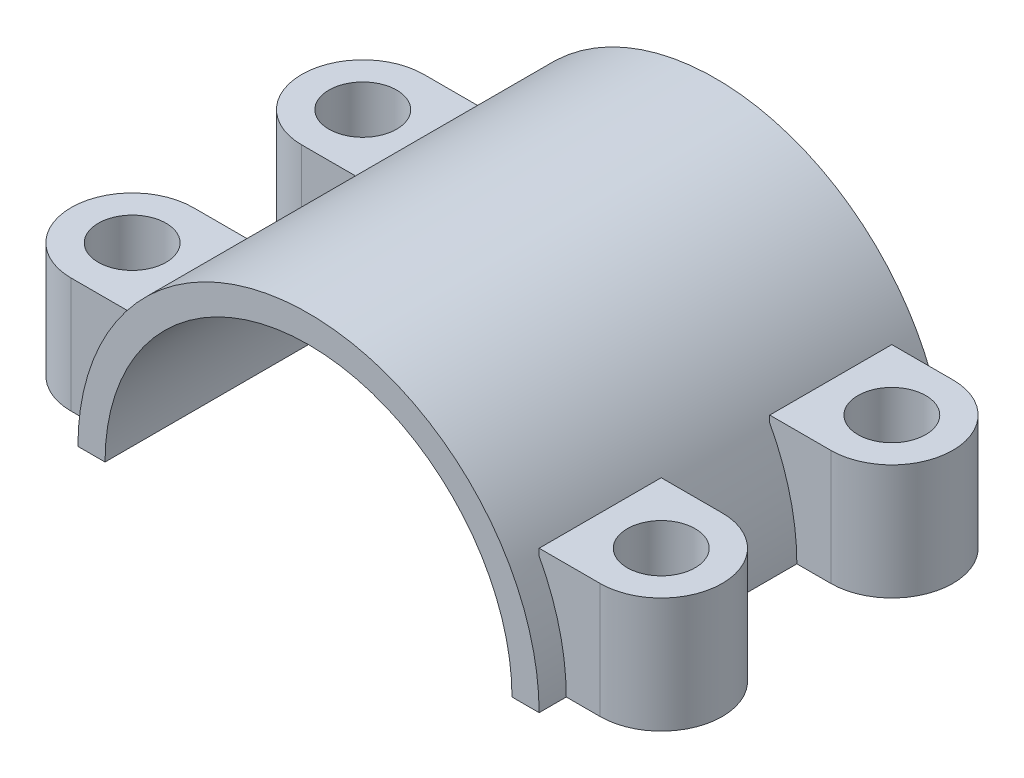
ISO-10303-21;
HEADER;
FILE_DESCRIPTION(('STEP AP214'),'2;1');
FILE_NAME('part.step','',(''),(''),'','','');
FILE_SCHEMA(('AUTOMOTIVE_DESIGN { 1 0 10303 214 1 1 1 1 }'));
ENDSEC;
DATA;
#1=APPLICATION_CONTEXT('core data for automotive mechanical design processes');
#2=APPLICATION_PROTOCOL_DEFINITION('international standard','automotive_design',2000,#1);
#3=PRODUCT_CONTEXT('',#1,'mechanical');
#4=PRODUCT('Part','Part','',(#3));
#5=PRODUCT_RELATED_PRODUCT_CATEGORY('part','',(#4));
#6=PRODUCT_DEFINITION_FORMATION('','',#4);
#7=PRODUCT_DEFINITION_CONTEXT('part definition',#1,'design');
#8=PRODUCT_DEFINITION('design','',#6,#7);
#9=PRODUCT_DEFINITION_SHAPE('','',#8);
#10=(LENGTH_UNIT() NAMED_UNIT(*) SI_UNIT(.MILLI.,.METRE.));
#11=(NAMED_UNIT(*) PLANE_ANGLE_UNIT() SI_UNIT($,.RADIAN.));
#12=(NAMED_UNIT(*) SI_UNIT($,.STERADIAN.) SOLID_ANGLE_UNIT());
#13=UNCERTAINTY_MEASURE_WITH_UNIT(LENGTH_MEASURE(1.E-05),#10,'distance_accuracy_value','');
#14=(GEOMETRIC_REPRESENTATION_CONTEXT(3) GLOBAL_UNCERTAINTY_ASSIGNED_CONTEXT((#13)) GLOBAL_UNIT_ASSIGNED_CONTEXT((#10,
#11,#12)) REPRESENTATION_CONTEXT('',''));
#15=CARTESIAN_POINT('',(0.,0.,0.));
#16=DIRECTION('',(0.,0.,1.));
#17=DIRECTION('',(1.,0.,0.));
#18=AXIS2_PLACEMENT_3D('',#15,#16,#17);
#19=CARTESIAN_POINT('',(24.765,10.795,8.255));
#20=DIRECTION('',(0.,-1.,0.));
#21=DIRECTION('',(0.,0.,-1.));
#22=AXIS2_PLACEMENT_3D('',#19,#20,#21);
#23=CYLINDRICAL_SURFACE('',#22,5.715);
#24=CARTESIAN_POINT('',(24.765,0.,8.255));
#25=DIRECTION('',(0.,-1.,0.));
#26=DIRECTION('',(0.,0.,1.));
#27=AXIS2_PLACEMENT_3D('',#24,#25,#26);
#28=CIRCLE('',#27,5.715);
#29=CARTESIAN_POINT('',(24.765,0.,2.54));
#30=VERTEX_POINT('',#29);
#31=CARTESIAN_POINT('',(24.765,0.,13.97));
#32=VERTEX_POINT('',#31);
#33=EDGE_CURVE('E212',#30,#32,#28,.T.);
#34=ORIENTED_EDGE('',*,*,#33,.F.);
#35=DIRECTION('',(0.,-1.,0.));
#36=VECTOR('',#35,1.);
#37=CARTESIAN_POINT('',(24.765,10.795,2.54));
#38=LINE('',#37,#36);
#39=CARTESIAN_POINT('',(24.765,10.795,2.54));
#40=VERTEX_POINT('',#39);
#41=EDGE_CURVE('E51',#40,#30,#38,.T.);
#42=ORIENTED_EDGE('',*,*,#41,.F.);
#43=CARTESIAN_POINT('',(24.765,10.795,8.255));
#44=DIRECTION('',(0.,-1.,0.));
#45=DIRECTION('',(0.,0.,1.));
#46=AXIS2_PLACEMENT_3D('',#43,#44,#45);
#47=CIRCLE('',#46,5.715);
#48=CARTESIAN_POINT('',(24.765,10.795,13.97));
#49=VERTEX_POINT('',#48);
#50=EDGE_CURVE('E210',#40,#49,#47,.T.);
#51=ORIENTED_EDGE('',*,*,#50,.T.);
#52=DIRECTION('',(0.,-1.,0.));
#53=VECTOR('',#52,1.);
#54=CARTESIAN_POINT('',(24.765,10.795,13.97));
#55=LINE('',#54,#53);
#56=EDGE_CURVE('E482',#49,#32,#55,.T.);
#57=ORIENTED_EDGE('',*,*,#56,.T.);
#58=EDGE_LOOP('',(#34,#42,#51,#57));
#59=FACE_BOUND('',#58,.T.);
#60=ADVANCED_FACE('F36',(#59),#23,.T.);
#61=CARTESIAN_POINT('',(24.765,10.795,29.845));
#62=DIRECTION('',(0.,-1.,0.));
#63=DIRECTION('',(0.,0.,-1.));
#64=AXIS2_PLACEMENT_3D('',#61,#62,#63);
#65=CYLINDRICAL_SURFACE('',#64,5.715);
#66=CARTESIAN_POINT('',(24.765,0.,29.845));
#67=DIRECTION('',(0.,-1.,0.));
#68=DIRECTION('',(0.,0.,1.));
#69=AXIS2_PLACEMENT_3D('',#66,#67,#68);
#70=CIRCLE('',#69,5.715);
#71=CARTESIAN_POINT('',(24.765,0.,24.13));
#72=VERTEX_POINT('',#71);
#73=CARTESIAN_POINT('',(24.765,0.,35.56));
#74=VERTEX_POINT('',#73);
#75=EDGE_CURVE('E219',#72,#74,#70,.T.);
#76=ORIENTED_EDGE('',*,*,#75,.F.);
#77=DIRECTION('',(0.,-1.,0.));
#78=VECTOR('',#77,1.);
#79=CARTESIAN_POINT('',(24.765,10.795,24.13));
#80=LINE('',#79,#78);
#81=CARTESIAN_POINT('',(24.765,10.795,24.13));
#82=VERTEX_POINT('',#81);
#83=EDGE_CURVE('E518',#82,#72,#80,.T.);
#84=ORIENTED_EDGE('',*,*,#83,.F.);
#85=CARTESIAN_POINT('',(24.765,10.795,29.845));
#86=DIRECTION('',(0.,-1.,0.));
#87=DIRECTION('',(0.,0.,1.));
#88=AXIS2_PLACEMENT_3D('',#85,#86,#87);
#89=CIRCLE('',#88,5.715);
#90=CARTESIAN_POINT('',(24.765,10.795,35.56));
#91=VERTEX_POINT('',#90);
#92=EDGE_CURVE('E222',#82,#91,#89,.T.);
#93=ORIENTED_EDGE('',*,*,#92,.T.);
#94=DIRECTION('',(0.,-1.,0.));
#95=VECTOR('',#94,1.);
#96=CARTESIAN_POINT('',(24.765,10.795,35.56));
#97=LINE('',#96,#95);
#98=EDGE_CURVE('E506',#91,#74,#97,.T.);
#99=ORIENTED_EDGE('',*,*,#98,.T.);
#100=EDGE_LOOP('',(#76,#84,#93,#99));
#101=FACE_BOUND('',#100,.T.);
#102=ADVANCED_FACE('F402',(#101),#65,.T.);
#103=CARTESIAN_POINT('',(0.,0.,38.1));
#104=DIRECTION('',(0.,0.,-1.));
#105=DIRECTION('',(-1.,0.,0.));
#106=AXIS2_PLACEMENT_3D('',#103,#104,#105);
#107=CYLINDRICAL_SURFACE('',#106,21.59);
#108=DIRECTION('',(0.,0.,-1.));
#109=VECTOR('',#108,1.);
#110=CARTESIAN_POINT('',(19.05,10.16,38.1));
#111=LINE('',#110,#109);
#112=CARTESIAN_POINT('',(19.05,10.16,13.97));
#113=VERTEX_POINT('',#112);
#114=CARTESIAN_POINT('',(19.05,10.16,2.54));
#115=VERTEX_POINT('',#114);
#116=EDGE_CURVE('E494',#113,#115,#111,.T.);
#117=ORIENTED_EDGE('',*,*,#116,.T.);
#118=CARTESIAN_POINT('',(0.,0.,2.54));
#119=DIRECTION('',(0.,0.,-1.));
#120=DIRECTION('',(-1.,0.,0.));
#121=AXIS2_PLACEMENT_3D('',#118,#119,#120);
#122=CIRCLE('',#121,21.59);
#123=CARTESIAN_POINT('',(21.59,0.,2.54));
#124=VERTEX_POINT('',#123);
#125=EDGE_CURVE('E356',#115,#124,#122,.T.);
#126=ORIENTED_EDGE('',*,*,#125,.T.);
#127=DIRECTION('',(0.,0.,-1.));
#128=VECTOR('',#127,1.);
#129=CARTESIAN_POINT('',(21.59,0.,38.1));
#130=LINE('',#129,#128);
#131=CARTESIAN_POINT('',(21.59,0.,0.));
#132=VERTEX_POINT('',#131);
#133=EDGE_CURVE('E343',#124,#132,#130,.T.);
#134=ORIENTED_EDGE('',*,*,#133,.T.);
#135=CARTESIAN_POINT('',(0.,0.,0.));
#136=DIRECTION('',(0.,0.,1.));
#137=DIRECTION('',(1.,0.,0.));
#138=AXIS2_PLACEMENT_3D('',#135,#136,#137);
#139=CIRCLE('',#138,21.59);
#140=CARTESIAN_POINT('',(-21.59,0.,0.));
#141=VERTEX_POINT('',#140);
#142=EDGE_CURVE('E334',#132,#141,#139,.T.);
#143=ORIENTED_EDGE('',*,*,#142,.T.);
#144=DIRECTION('',(0.,0.,-1.));
#145=VECTOR('',#144,1.);
#146=CARTESIAN_POINT('',(-21.59,0.,38.1));
#147=LINE('',#146,#145);
#148=CARTESIAN_POINT('',(-21.59,0.,2.54000000000001));
#149=VERTEX_POINT('',#148);
#150=EDGE_CURVE('E340',#149,#141,#147,.T.);
#151=ORIENTED_EDGE('',*,*,#150,.F.);
#152=CARTESIAN_POINT('',(0.,0.,2.54));
#153=DIRECTION('',(0.,0.,1.));
#154=DIRECTION('',(1.,0.,0.));
#155=AXIS2_PLACEMENT_3D('',#152,#153,#154);
#156=CIRCLE('',#155,21.59);
#157=CARTESIAN_POINT('',(-19.05,10.16,2.54));
#158=VERTEX_POINT('',#157);
#159=EDGE_CURVE('E268',#158,#149,#156,.T.);
#160=ORIENTED_EDGE('',*,*,#159,.F.);
#161=DIRECTION('',(0.,0.,-1.));
#162=VECTOR('',#161,1.);
#163=CARTESIAN_POINT('',(-19.05,10.16,38.1));
#164=LINE('',#163,#162);
#165=CARTESIAN_POINT('',(-19.05,10.16,13.97));
#166=VERTEX_POINT('',#165);
#167=EDGE_CURVE('E59',#166,#158,#164,.T.);
#168=ORIENTED_EDGE('',*,*,#167,.F.);
#169=CARTESIAN_POINT('',(0.,0.,13.97));
#170=DIRECTION('',(0.,0.,-1.));
#171=DIRECTION('',(-1.,0.,0.));
#172=AXIS2_PLACEMENT_3D('',#169,#170,#171);
#173=CIRCLE('',#172,21.59);
#174=CARTESIAN_POINT('',(-21.59,0.,13.97));
#175=VERTEX_POINT('',#174);
#176=EDGE_CURVE('E272',#175,#166,#173,.T.);
#177=ORIENTED_EDGE('',*,*,#176,.F.);
#178=CARTESIAN_POINT('',(-21.59,0.,24.13));
#179=VERTEX_POINT('',#178);
#180=EDGE_CURVE('E344',#179,#175,#147,.T.);
#181=ORIENTED_EDGE('',*,*,#180,.F.);
#182=CARTESIAN_POINT('',(0.,0.,24.13));
#183=DIRECTION('',(0.,0.,1.));
#184=DIRECTION('',(1.,0.,0.));
#185=AXIS2_PLACEMENT_3D('',#182,#183,#184);
#186=CIRCLE('',#185,21.59);
#187=CARTESIAN_POINT('',(-19.05,10.16,24.13));
#188=VERTEX_POINT('',#187);
#189=EDGE_CURVE('E299',#188,#179,#186,.T.);
#190=ORIENTED_EDGE('',*,*,#189,.F.);
#191=DIRECTION('',(0.,0.,-1.));
#192=VECTOR('',#191,1.);
#193=CARTESIAN_POINT('',(-19.05,10.16,38.1));
#194=LINE('',#193,#192);
#195=CARTESIAN_POINT('',(-19.05,10.16,35.56));
#196=VERTEX_POINT('',#195);
#197=EDGE_CURVE('E302',#196,#188,#194,.T.);
#198=ORIENTED_EDGE('',*,*,#197,.F.);
#199=CARTESIAN_POINT('',(0.,0.,35.56));
#200=DIRECTION('',(0.,0.,-1.));
#201=DIRECTION('',(-1.,0.,0.));
#202=AXIS2_PLACEMENT_3D('',#199,#200,#201);
#203=CIRCLE('',#202,21.59);
#204=CARTESIAN_POINT('',(-21.59,0.,35.56));
#205=VERTEX_POINT('',#204);
#206=EDGE_CURVE('E304',#205,#196,#203,.T.);
#207=ORIENTED_EDGE('',*,*,#206,.F.);
#208=CARTESIAN_POINT('',(-21.59,0.,38.1));
#209=VERTEX_POINT('',#208);
#210=EDGE_CURVE('E341',#209,#205,#147,.T.);
#211=ORIENTED_EDGE('',*,*,#210,.F.);
#212=CARTESIAN_POINT('',(0.,0.,38.1));
#213=DIRECTION('',(0.,0.,1.));
#214=DIRECTION('',(1.,0.,0.));
#215=AXIS2_PLACEMENT_3D('',#212,#213,#214);
#216=CIRCLE('',#215,21.59);
#217=CARTESIAN_POINT('',(21.59,0.,38.1));
#218=VERTEX_POINT('',#217);
#219=EDGE_CURVE('E324',#218,#209,#216,.T.);
#220=ORIENTED_EDGE('',*,*,#219,.F.);
#221=CARTESIAN_POINT('',(21.59,0.,35.56));
#222=VERTEX_POINT('',#221);
#223=EDGE_CURVE('E44',#218,#222,#130,.T.);
#224=ORIENTED_EDGE('',*,*,#223,.T.);
#225=CARTESIAN_POINT('',(0.,0.,35.56));
#226=DIRECTION('',(0.,0.,1.));
#227=DIRECTION('',(1.,0.,0.));
#228=AXIS2_PLACEMENT_3D('',#225,#226,#227);
#229=CIRCLE('',#228,21.59);
#230=CARTESIAN_POINT('',(19.05,10.16,35.56));
#231=VERTEX_POINT('',#230);
#232=EDGE_CURVE('E521',#222,#231,#229,.T.);
#233=ORIENTED_EDGE('',*,*,#232,.T.);
#234=DIRECTION('',(0.,0.,-1.));
#235=VECTOR('',#234,1.);
#236=CARTESIAN_POINT('',(19.05,10.16,38.1));
#237=LINE('',#236,#235);
#238=CARTESIAN_POINT('',(19.05,10.16,24.13));
#239=VERTEX_POINT('',#238);
#240=EDGE_CURVE('E522',#231,#239,#237,.T.);
#241=ORIENTED_EDGE('',*,*,#240,.T.);
#242=CARTESIAN_POINT('',(0.,0.,24.13));
#243=DIRECTION('',(0.,0.,-1.));
#244=DIRECTION('',(-1.,0.,0.));
#245=AXIS2_PLACEMENT_3D('',#242,#243,#244);
#246=CIRCLE('',#245,21.59);
#247=CARTESIAN_POINT('',(21.59,0.,24.13));
#248=VERTEX_POINT('',#247);
#249=EDGE_CURVE('E224',#239,#248,#246,.T.);
#250=ORIENTED_EDGE('',*,*,#249,.T.);
#251=CARTESIAN_POINT('',(21.59,0.,13.97));
#252=VERTEX_POINT('',#251);
#253=EDGE_CURVE('E346',#248,#252,#130,.T.);
#254=ORIENTED_EDGE('',*,*,#253,.T.);
#255=CARTESIAN_POINT('',(0.,0.,13.97));
#256=DIRECTION('',(0.,0.,1.));
#257=DIRECTION('',(1.,0.,0.));
#258=AXIS2_PLACEMENT_3D('',#255,#256,#257);
#259=CIRCLE('',#258,21.59);
#260=EDGE_CURVE('E213',#252,#113,#259,.T.);
#261=ORIENTED_EDGE('',*,*,#260,.T.);
#262=EDGE_LOOP('',(#117,#126,#134,#143,#151,#160,#168,#177,#181,#190,#198,#207,#211,#220,#224,
#233,#241,#250,#254,#261));
#263=FACE_BOUND('',#262,.T.);
#264=ADVANCED_FACE('F353',(#263),#107,.T.);
#265=CARTESIAN_POINT('',(-24.765,10.795,8.255));
#266=DIRECTION('',(0.,-1.,0.));
#267=DIRECTION('',(0.,0.,-1.));
#268=AXIS2_PLACEMENT_3D('',#265,#266,#267);
#269=CYLINDRICAL_SURFACE('',#268,5.715);
#270=DIRECTION('',(0.,-1.,0.));
#271=VECTOR('',#270,1.);
#272=CARTESIAN_POINT('',(-24.765,10.795,13.97));
#273=LINE('',#272,#271);
#274=CARTESIAN_POINT('',(-24.765,10.795,13.97));
#275=VERTEX_POINT('',#274);
#276=CARTESIAN_POINT('',(-24.765,0.,13.97));
#277=VERTEX_POINT('',#276);
#278=EDGE_CURVE('E265',#275,#277,#273,.T.);
#279=ORIENTED_EDGE('',*,*,#278,.F.);
#280=CARTESIAN_POINT('',(-24.765,10.795,8.255));
#281=DIRECTION('',(0.,1.,0.));
#282=DIRECTION('',(0.,0.,1.));
#283=AXIS2_PLACEMENT_3D('',#280,#281,#282);
#284=CIRCLE('',#283,5.715);
#285=CARTESIAN_POINT('',(-24.765,10.795,2.54));
#286=VERTEX_POINT('',#285);
#287=EDGE_CURVE('E307',#286,#275,#284,.T.);
#288=ORIENTED_EDGE('',*,*,#287,.F.);
#289=DIRECTION('',(0.,-1.,0.));
#290=VECTOR('',#289,1.);
#291=CARTESIAN_POINT('',(-24.765,10.795,2.54));
#292=LINE('',#291,#290);
#293=CARTESIAN_POINT('',(-24.765,0.,2.54));
#294=VERTEX_POINT('',#293);
#295=EDGE_CURVE('E252',#286,#294,#292,.T.);
#296=ORIENTED_EDGE('',*,*,#295,.T.);
#297=CARTESIAN_POINT('',(-24.765,0.,8.255));
#298=DIRECTION('',(0.,1.,0.));
#299=DIRECTION('',(0.,0.,1.));
#300=AXIS2_PLACEMENT_3D('',#297,#298,#299);
#301=CIRCLE('',#300,5.715);
#302=EDGE_CURVE('E308',#294,#277,#301,.T.);
#303=ORIENTED_EDGE('',*,*,#302,.T.);
#304=EDGE_LOOP('',(#279,#288,#296,#303));
#305=FACE_BOUND('',#304,.T.);
#306=ADVANCED_FACE('F380',(#305),#269,.T.);
#307=CARTESIAN_POINT('',(-24.765,10.795,29.845));
#308=DIRECTION('',(0.,-1.,0.));
#309=DIRECTION('',(0.,0.,-1.));
#310=AXIS2_PLACEMENT_3D('',#307,#308,#309);
#311=CYLINDRICAL_SURFACE('',#310,5.715);
#312=DIRECTION('',(0.,-1.,0.));
#313=VECTOR('',#312,1.);
#314=CARTESIAN_POINT('',(-24.765,10.795,35.56));
#315=LINE('',#314,#313);
#316=CARTESIAN_POINT('',(-24.765,10.795,35.56));
#317=VERTEX_POINT('',#316);
#318=CARTESIAN_POINT('',(-24.765,0.,35.56));
#319=VERTEX_POINT('',#318);
#320=EDGE_CURVE('E296',#317,#319,#315,.T.);
#321=ORIENTED_EDGE('',*,*,#320,.F.);
#322=CARTESIAN_POINT('',(-24.765,10.795,29.845));
#323=DIRECTION('',(0.,1.,0.));
#324=DIRECTION('',(0.,0.,1.));
#325=AXIS2_PLACEMENT_3D('',#322,#323,#324);
#326=CIRCLE('',#325,5.715);
#327=CARTESIAN_POINT('',(-24.765,10.795,24.13));
#328=VERTEX_POINT('',#327);
#329=EDGE_CURVE('E313',#328,#317,#326,.T.);
#330=ORIENTED_EDGE('',*,*,#329,.F.);
#331=DIRECTION('',(0.,-1.,0.));
#332=VECTOR('',#331,1.);
#333=CARTESIAN_POINT('',(-24.765,10.795,24.13));
#334=LINE('',#333,#332);
#335=CARTESIAN_POINT('',(-24.765,0.,24.13));
#336=VERTEX_POINT('',#335);
#337=EDGE_CURVE('E284',#328,#336,#334,.T.);
#338=ORIENTED_EDGE('',*,*,#337,.T.);
#339=CARTESIAN_POINT('',(-24.765,0.,29.845));
#340=DIRECTION('',(0.,1.,0.));
#341=DIRECTION('',(0.,0.,1.));
#342=AXIS2_PLACEMENT_3D('',#339,#340,#341);
#343=CIRCLE('',#342,5.715);
#344=EDGE_CURVE('E310',#336,#319,#343,.T.);
#345=ORIENTED_EDGE('',*,*,#344,.T.);
#346=EDGE_LOOP('',(#321,#330,#338,#345));
#347=FACE_BOUND('',#346,.T.);
#348=ADVANCED_FACE('F443',(#347),#311,.T.);
#349=CARTESIAN_POINT('',(0.,0.,38.1));
#350=DIRECTION('',(0.,0.,-1.));
#351=DIRECTION('',(-1.,0.,0.));
#352=AXIS2_PLACEMENT_3D('',#349,#350,#351);
#353=CYLINDRICAL_SURFACE('',#352,19.05);
#354=CARTESIAN_POINT('',(0.,0.,0.));
#355=DIRECTION('',(0.,0.,-1.));
#356=DIRECTION('',(1.,0.,0.));
#357=AXIS2_PLACEMENT_3D('',#354,#355,#356);
#358=CIRCLE('',#357,19.05);
#359=CARTESIAN_POINT('',(-19.05,0.,0.));
#360=VERTEX_POINT('',#359);
#361=CARTESIAN_POINT('',(19.05,0.,0.));
#362=VERTEX_POINT('',#361);
#363=EDGE_CURVE('E316',#360,#362,#358,.T.);
#364=ORIENTED_EDGE('',*,*,#363,.T.);
#365=DIRECTION('',(0.,0.,-1.));
#366=VECTOR('',#365,1.);
#367=CARTESIAN_POINT('',(19.05,0.,38.1));
#368=LINE('',#367,#366);
#369=CARTESIAN_POINT('',(19.05,0.,38.1));
#370=VERTEX_POINT('',#369);
#371=EDGE_CURVE('E11',#370,#362,#368,.T.);
#372=ORIENTED_EDGE('',*,*,#371,.F.);
#373=CARTESIAN_POINT('',(0.,0.,38.1));
#374=DIRECTION('',(0.,0.,-1.));
#375=DIRECTION('',(1.,0.,0.));
#376=AXIS2_PLACEMENT_3D('',#373,#374,#375);
#377=CIRCLE('',#376,19.05);
#378=CARTESIAN_POINT('',(-19.05,0.,38.1));
#379=VERTEX_POINT('',#378);
#380=EDGE_CURVE('E318',#379,#370,#377,.T.);
#381=ORIENTED_EDGE('',*,*,#380,.F.);
#382=DIRECTION('',(0.,0.,-1.));
#383=VECTOR('',#382,1.);
#384=CARTESIAN_POINT('',(-19.05,0.,38.1));
#385=LINE('',#384,#383);
#386=EDGE_CURVE('E328',#379,#360,#385,.T.);
#387=ORIENTED_EDGE('',*,*,#386,.T.);
#388=EDGE_LOOP('',(#364,#372,#381,#387));
#389=FACE_BOUND('',#388,.T.);
#390=ADVANCED_FACE('F38',(#389),#353,.F.);
#391=CARTESIAN_POINT('',(19.05,0.,38.1));
#392=DIRECTION('',(0.,1.,0.));
#393=DIRECTION('',(0.,0.,1.));
#394=AXIS2_PLACEMENT_3D('',#391,#392,#393);
#395=PLANE('',#394);
#396=CARTESIAN_POINT('',(24.765,0.,29.845));
#397=DIRECTION('',(0.,-1.,0.));
#398=DIRECTION('',(0.,0.,1.));
#399=AXIS2_PLACEMENT_3D('',#396,#397,#398);
#400=CIRCLE('',#399,3.175);
#401=CARTESIAN_POINT('',(24.765,0.,33.02));
#402=VERTEX_POINT('',#401);
#403=EDGE_CURVE('E466',#402,#402,#400,.T.);
#404=ORIENTED_EDGE('',*,*,#403,.F.);
#405=EDGE_LOOP('',(#404));
#406=FACE_BOUND('',#405,.T.);
#407=CARTESIAN_POINT('',(24.765,0.,8.255));
#408=DIRECTION('',(0.,-1.,0.));
#409=DIRECTION('',(0.,0.,1.));
#410=AXIS2_PLACEMENT_3D('',#407,#408,#409);
#411=CIRCLE('',#410,3.175);
#412=CARTESIAN_POINT('',(24.765,0.,11.43));
#413=VERTEX_POINT('',#412);
#414=EDGE_CURVE('E469',#413,#413,#411,.T.);
#415=ORIENTED_EDGE('',*,*,#414,.F.);
#416=EDGE_LOOP('',(#415));
#417=FACE_BOUND('',#416,.T.);
#418=ORIENTED_EDGE('',*,*,#133,.F.);
#419=DIRECTION('',(1.,0.,0.));
#420=VECTOR('',#419,1.);
#421=CARTESIAN_POINT('',(19.05,0.,2.54));
#422=LINE('',#421,#420);
#423=EDGE_CURVE('E483',#124,#30,#422,.T.);
#424=ORIENTED_EDGE('',*,*,#423,.T.);
#425=ORIENTED_EDGE('',*,*,#33,.T.);
#426=DIRECTION('',(-1.,0.,0.));
#427=VECTOR('',#426,1.);
#428=CARTESIAN_POINT('',(24.765,0.,13.97));
#429=LINE('',#428,#427);
#430=EDGE_CURVE('E204',#32,#252,#429,.T.);
#431=ORIENTED_EDGE('',*,*,#430,.T.);
#432=ORIENTED_EDGE('',*,*,#253,.F.);
#433=DIRECTION('',(1.,0.,0.));
#434=VECTOR('',#433,1.);
#435=CARTESIAN_POINT('',(24.765,0.,24.13));
#436=LINE('',#435,#434);
#437=EDGE_CURVE('E497',#248,#72,#436,.T.);
#438=ORIENTED_EDGE('',*,*,#437,.T.);
#439=ORIENTED_EDGE('',*,*,#75,.T.);
#440=DIRECTION('',(-1.,0.,0.));
#441=VECTOR('',#440,1.);
#442=CARTESIAN_POINT('',(19.05,0.,35.56));
#443=LINE('',#442,#441);
#444=EDGE_CURVE('E501',#74,#222,#443,.T.);
#445=ORIENTED_EDGE('',*,*,#444,.T.);
#446=ORIENTED_EDGE('',*,*,#223,.F.);
#447=DIRECTION('',(1.,0.,0.));
#448=VECTOR('',#447,1.);
#449=CARTESIAN_POINT('',(19.05,0.,38.1));
#450=LINE('',#449,#448);
#451=EDGE_CURVE('E321',#370,#218,#450,.T.);
#452=ORIENTED_EDGE('',*,*,#451,.F.);
#453=ORIENTED_EDGE('',*,*,#371,.T.);
#454=DIRECTION('',(1.,0.,0.));
#455=VECTOR('',#454,1.);
#456=CARTESIAN_POINT('',(19.05,0.,0.));
#457=LINE('',#456,#455);
#458=EDGE_CURVE('E331',#362,#132,#457,.T.);
#459=ORIENTED_EDGE('',*,*,#458,.T.);
#460=EDGE_LOOP('',(#418,#424,#425,#431,#432,#438,#439,#445,#446,#452,#453,#459));
#461=FACE_BOUND('',#460,.T.);
#462=ADVANCED_FACE('F359',(#406,#417,#461),#395,.F.);
#463=CARTESIAN_POINT('',(-21.59,0.,38.1));
#464=DIRECTION('',(0.,1.,0.));
#465=DIRECTION('',(0.,0.,1.));
#466=AXIS2_PLACEMENT_3D('',#463,#464,#465);
#467=PLANE('',#466);
#468=CARTESIAN_POINT('',(-24.765,0.,29.845));
#469=DIRECTION('',(0.,1.,0.));
#470=DIRECTION('',(0.,0.,1.));
#471=AXIS2_PLACEMENT_3D('',#468,#469,#470);
#472=CIRCLE('',#471,3.175);
#473=CARTESIAN_POINT('',(-24.765,0.,33.02));
#474=VERTEX_POINT('',#473);
#475=EDGE_CURVE('E232',#474,#474,#472,.T.);
#476=ORIENTED_EDGE('',*,*,#475,.T.);
#477=EDGE_LOOP('',(#476));
#478=FACE_BOUND('',#477,.T.);
#479=CARTESIAN_POINT('',(-24.765,0.,8.255));
#480=DIRECTION('',(0.,1.,0.));
#481=DIRECTION('',(0.,0.,1.));
#482=AXIS2_PLACEMENT_3D('',#479,#480,#481);
#483=CIRCLE('',#482,3.175);
#484=CARTESIAN_POINT('',(-24.765,0.,11.43));
#485=VERTEX_POINT('',#484);
#486=EDGE_CURVE('E230',#485,#485,#483,.T.);
#487=ORIENTED_EDGE('',*,*,#486,.T.);
#488=EDGE_LOOP('',(#487));
#489=FACE_BOUND('',#488,.T.);
#490=DIRECTION('',(-1.,0.,0.));
#491=VECTOR('',#490,1.);
#492=CARTESIAN_POINT('',(-19.05,0.,2.54));
#493=LINE('',#492,#491);
#494=EDGE_CURVE('E247',#149,#294,#493,.T.);
#495=ORIENTED_EDGE('',*,*,#494,.F.);
#496=ORIENTED_EDGE('',*,*,#150,.T.);
#497=DIRECTION('',(1.,0.,0.));
#498=VECTOR('',#497,1.);
#499=CARTESIAN_POINT('',(-21.59,0.,0.));
#500=LINE('',#499,#498);
#501=EDGE_CURVE('E322',#141,#360,#500,.T.);
#502=ORIENTED_EDGE('',*,*,#501,.T.);
#503=ORIENTED_EDGE('',*,*,#386,.F.);
#504=DIRECTION('',(1.,0.,0.));
#505=VECTOR('',#504,1.);
#506=CARTESIAN_POINT('',(-21.59,0.,38.1));
#507=LINE('',#506,#505);
#508=EDGE_CURVE('E326',#209,#379,#507,.T.);
#509=ORIENTED_EDGE('',*,*,#508,.F.);
#510=ORIENTED_EDGE('',*,*,#210,.T.);
#511=DIRECTION('',(1.,0.,0.));
#512=VECTOR('',#511,1.);
#513=CARTESIAN_POINT('',(-19.05,0.,35.56));
#514=LINE('',#513,#512);
#515=EDGE_CURVE('E274',#319,#205,#514,.T.);
#516=ORIENTED_EDGE('',*,*,#515,.F.);
#517=ORIENTED_EDGE('',*,*,#344,.F.);
#518=DIRECTION('',(-1.,0.,0.));
#519=VECTOR('',#518,1.);
#520=CARTESIAN_POINT('',(-24.765,0.,24.13));
#521=LINE('',#520,#519);
#522=EDGE_CURVE('E279',#179,#336,#521,.T.);
#523=ORIENTED_EDGE('',*,*,#522,.F.);
#524=ORIENTED_EDGE('',*,*,#180,.T.);
#525=DIRECTION('',(1.,0.,0.));
#526=VECTOR('',#525,1.);
#527=CARTESIAN_POINT('',(-24.765,0.,13.97));
#528=LINE('',#527,#526);
#529=EDGE_CURVE('E235',#277,#175,#528,.T.);
#530=ORIENTED_EDGE('',*,*,#529,.F.);
#531=ORIENTED_EDGE('',*,*,#302,.F.);
#532=EDGE_LOOP('',(#495,#496,#502,#503,#509,#510,#516,#517,#523,#524,#530,#531));
#533=FACE_BOUND('',#532,.T.);
#534=ADVANCED_FACE('F367',(#478,#489,#533),#467,.F.);
#535=CARTESIAN_POINT('',(0.,0.,38.1));
#536=DIRECTION('',(0.,0.,1.));
#537=DIRECTION('',(1.,0.,0.));
#538=AXIS2_PLACEMENT_3D('',#535,#536,#537);
#539=PLANE('',#538);
#540=ORIENTED_EDGE('',*,*,#380,.T.);
#541=ORIENTED_EDGE('',*,*,#451,.T.);
#542=ORIENTED_EDGE('',*,*,#219,.T.);
#543=ORIENTED_EDGE('',*,*,#508,.T.);
#544=EDGE_LOOP('',(#540,#541,#542,#543));
#545=FACE_BOUND('',#544,.T.);
#546=ADVANCED_FACE('F447',(#545),#539,.T.);
#547=CARTESIAN_POINT('',(0.,0.,0.));
#548=DIRECTION('',(0.,0.,1.));
#549=DIRECTION('',(1.,0.,0.));
#550=AXIS2_PLACEMENT_3D('',#547,#548,#549);
#551=PLANE('',#550);
#552=ORIENTED_EDGE('',*,*,#363,.F.);
#553=ORIENTED_EDGE('',*,*,#501,.F.);
#554=ORIENTED_EDGE('',*,*,#142,.F.);
#555=ORIENTED_EDGE('',*,*,#458,.F.);
#556=EDGE_LOOP('',(#552,#553,#554,#555));
#557=FACE_BOUND('',#556,.T.);
#558=ADVANCED_FACE('F363',(#557),#551,.F.);
#559=CARTESIAN_POINT('',(-24.765,10.795,29.845));
#560=DIRECTION('',(0.,1.,0.));
#561=DIRECTION('',(0.,0.,1.));
#562=AXIS2_PLACEMENT_3D('',#559,#560,#561);
#563=PLANE('',#562);
#564=CARTESIAN_POINT('',(-24.765,10.795,29.845));
#565=DIRECTION('',(0.,1.,0.));
#566=DIRECTION('',(0.,0.,1.));
#567=AXIS2_PLACEMENT_3D('',#564,#565,#566);
#568=CIRCLE('',#567,3.175);
#569=CARTESIAN_POINT('',(-24.765,10.795,33.02));
#570=VERTEX_POINT('',#569);
#571=EDGE_CURVE('E236',#570,#570,#568,.T.);
#572=ORIENTED_EDGE('',*,*,#571,.F.);
#573=EDGE_LOOP('',(#572));
#574=FACE_BOUND('',#573,.T.);
#575=DIRECTION('',(1.,0.,0.));
#576=VECTOR('',#575,1.);
#577=CARTESIAN_POINT('',(-19.05,10.795,35.56));
#578=LINE('',#577,#576);
#579=CARTESIAN_POINT('',(-19.05,10.795,35.56));
#580=VERTEX_POINT('',#579);
#581=EDGE_CURVE('E275',#317,#580,#578,.T.);
#582=ORIENTED_EDGE('',*,*,#581,.T.);
#583=DIRECTION('',(0.,0.,-1.));
#584=VECTOR('',#583,1.);
#585=CARTESIAN_POINT('',(-19.05,10.795,24.13));
#586=LINE('',#585,#584);
#587=CARTESIAN_POINT('',(-19.05,10.795,24.13));
#588=VERTEX_POINT('',#587);
#589=EDGE_CURVE('E278',#580,#588,#586,.T.);
#590=ORIENTED_EDGE('',*,*,#589,.T.);
#591=DIRECTION('',(-1.,0.,0.));
#592=VECTOR('',#591,1.);
#593=CARTESIAN_POINT('',(-24.765,10.795,24.13));
#594=LINE('',#593,#592);
#595=EDGE_CURVE('E281',#588,#328,#594,.T.);
#596=ORIENTED_EDGE('',*,*,#595,.T.);
#597=ORIENTED_EDGE('',*,*,#329,.T.);
#598=EDGE_LOOP('',(#582,#590,#596,#597));
#599=FACE_BOUND('',#598,.T.);
#600=ADVANCED_FACE('F430',(#574,#599),#563,.T.);
#601=CARTESIAN_POINT('',(-24.765,10.795,8.255));
#602=DIRECTION('',(0.,1.,0.));
#603=DIRECTION('',(0.,0.,1.));
#604=AXIS2_PLACEMENT_3D('',#601,#602,#603);
#605=PLANE('',#604);
#606=CARTESIAN_POINT('',(-24.765,10.795,8.255));
#607=DIRECTION('',(0.,1.,0.));
#608=DIRECTION('',(0.,0.,1.));
#609=AXIS2_PLACEMENT_3D('',#606,#607,#608);
#610=CIRCLE('',#609,3.175);
#611=CARTESIAN_POINT('',(-24.765,10.795,11.43));
#612=VERTEX_POINT('',#611);
#613=EDGE_CURVE('E239',#612,#612,#610,.T.);
#614=ORIENTED_EDGE('',*,*,#613,.F.);
#615=EDGE_LOOP('',(#614));
#616=FACE_BOUND('',#615,.T.);
#617=ORIENTED_EDGE('',*,*,#287,.T.);
#618=DIRECTION('',(1.,0.,0.));
#619=VECTOR('',#618,1.);
#620=CARTESIAN_POINT('',(-24.765,10.795,13.97));
#621=LINE('',#620,#619);
#622=CARTESIAN_POINT('',(-19.05,10.795,13.97));
#623=VERTEX_POINT('',#622);
#624=EDGE_CURVE('E244',#275,#623,#621,.T.);
#625=ORIENTED_EDGE('',*,*,#624,.T.);
#626=DIRECTION('',(0.,0.,-1.));
#627=VECTOR('',#626,1.);
#628=CARTESIAN_POINT('',(-19.05,10.795,13.97));
#629=LINE('',#628,#627);
#630=CARTESIAN_POINT('',(-19.05,10.795,2.54));
#631=VERTEX_POINT('',#630);
#632=EDGE_CURVE('E246',#623,#631,#629,.T.);
#633=ORIENTED_EDGE('',*,*,#632,.T.);
#634=DIRECTION('',(-1.,0.,0.));
#635=VECTOR('',#634,1.);
#636=CARTESIAN_POINT('',(-19.05,10.795,2.54));
#637=LINE('',#636,#635);
#638=EDGE_CURVE('E249',#631,#286,#637,.T.);
#639=ORIENTED_EDGE('',*,*,#638,.T.);
#640=EDGE_LOOP('',(#617,#625,#633,#639));
#641=FACE_BOUND('',#640,.T.);
#642=ADVANCED_FACE('F382',(#616,#641),#605,.T.);
#643=CARTESIAN_POINT('',(-19.05,10.795,35.56));
#644=DIRECTION('',(0.,0.,-1.));
#645=DIRECTION('',(-1.,0.,0.));
#646=AXIS2_PLACEMENT_3D('',#643,#644,#645);
#647=PLANE('',#646);
#648=ORIENTED_EDGE('',*,*,#515,.T.);
#649=ORIENTED_EDGE('',*,*,#206,.T.);
#650=DIRECTION('',(0.,-1.,0.));
#651=VECTOR('',#650,1.);
#652=CARTESIAN_POINT('',(-19.05,10.795,35.56));
#653=LINE('',#652,#651);
#654=EDGE_CURVE('E293',#580,#196,#653,.T.);
#655=ORIENTED_EDGE('',*,*,#654,.F.);
#656=ORIENTED_EDGE('',*,*,#581,.F.);
#657=ORIENTED_EDGE('',*,*,#320,.T.);
#658=EDGE_LOOP('',(#648,#649,#655,#656,#657));
#659=FACE_BOUND('',#658,.T.);
#660=ADVANCED_FACE('F429',(#659),#647,.F.);
#661=CARTESIAN_POINT('',(-19.05,10.795,24.13));
#662=DIRECTION('',(-1.,0.,0.));
#663=DIRECTION('',(0.,0.,1.));
#664=AXIS2_PLACEMENT_3D('',#661,#662,#663);
#665=PLANE('',#664);
#666=ORIENTED_EDGE('',*,*,#654,.T.);
#667=ORIENTED_EDGE('',*,*,#197,.T.);
#668=DIRECTION('',(0.,-1.,0.));
#669=VECTOR('',#668,1.);
#670=CARTESIAN_POINT('',(-19.05,10.795,24.13));
#671=LINE('',#670,#669);
#672=EDGE_CURVE('E290',#588,#188,#671,.T.);
#673=ORIENTED_EDGE('',*,*,#672,.F.);
#674=ORIENTED_EDGE('',*,*,#589,.F.);
#675=EDGE_LOOP('',(#666,#667,#673,#674));
#676=FACE_BOUND('',#675,.T.);
#677=ADVANCED_FACE('F436',(#676),#665,.F.);
#678=CARTESIAN_POINT('',(-24.765,10.795,24.13));
#679=DIRECTION('',(0.,0.,1.));
#680=DIRECTION('',(1.,0.,0.));
#681=AXIS2_PLACEMENT_3D('',#678,#679,#680);
#682=PLANE('',#681);
#683=ORIENTED_EDGE('',*,*,#672,.T.);
#684=ORIENTED_EDGE('',*,*,#189,.T.);
#685=ORIENTED_EDGE('',*,*,#522,.T.);
#686=ORIENTED_EDGE('',*,*,#337,.F.);
#687=ORIENTED_EDGE('',*,*,#595,.F.);
#688=EDGE_LOOP('',(#683,#684,#685,#686,#687));
#689=FACE_BOUND('',#688,.T.);
#690=ADVANCED_FACE('F399',(#689),#682,.F.);
#691=CARTESIAN_POINT('',(-24.765,10.795,13.97));
#692=DIRECTION('',(0.,0.,-1.));
#693=DIRECTION('',(-1.,0.,0.));
#694=AXIS2_PLACEMENT_3D('',#691,#692,#693);
#695=PLANE('',#694);
#696=ORIENTED_EDGE('',*,*,#529,.T.);
#697=ORIENTED_EDGE('',*,*,#176,.T.);
#698=DIRECTION('',(0.,-1.,0.));
#699=VECTOR('',#698,1.);
#700=CARTESIAN_POINT('',(-19.05,10.795,13.97));
#701=LINE('',#700,#699);
#702=EDGE_CURVE('E262',#623,#166,#701,.T.);
#703=ORIENTED_EDGE('',*,*,#702,.F.);
#704=ORIENTED_EDGE('',*,*,#624,.F.);
#705=ORIENTED_EDGE('',*,*,#278,.T.);
#706=EDGE_LOOP('',(#696,#697,#703,#704,#705));
#707=FACE_BOUND('',#706,.T.);
#708=ADVANCED_FACE('F376',(#707),#695,.F.);
#709=CARTESIAN_POINT('',(-19.05,10.795,13.97));
#710=DIRECTION('',(-1.,0.,0.));
#711=DIRECTION('',(0.,0.,1.));
#712=AXIS2_PLACEMENT_3D('',#709,#710,#711);
#713=PLANE('',#712);
#714=ORIENTED_EDGE('',*,*,#702,.T.);
#715=ORIENTED_EDGE('',*,*,#167,.T.);
#716=DIRECTION('',(0.,-1.,0.));
#717=VECTOR('',#716,1.);
#718=CARTESIAN_POINT('',(-19.05,10.795,2.54));
#719=LINE('',#718,#717);
#720=EDGE_CURVE('E259',#631,#158,#719,.T.);
#721=ORIENTED_EDGE('',*,*,#720,.F.);
#722=ORIENTED_EDGE('',*,*,#632,.F.);
#723=EDGE_LOOP('',(#714,#715,#721,#722));
#724=FACE_BOUND('',#723,.T.);
#725=ADVANCED_FACE('F390',(#724),#713,.F.);
#726=CARTESIAN_POINT('',(-19.05,10.795,2.54));
#727=DIRECTION('',(0.,0.,1.));
#728=DIRECTION('',(1.,0.,0.));
#729=AXIS2_PLACEMENT_3D('',#726,#727,#728);
#730=PLANE('',#729);
#731=ORIENTED_EDGE('',*,*,#720,.T.);
#732=ORIENTED_EDGE('',*,*,#159,.T.);
#733=ORIENTED_EDGE('',*,*,#494,.T.);
#734=ORIENTED_EDGE('',*,*,#295,.F.);
#735=ORIENTED_EDGE('',*,*,#638,.F.);
#736=EDGE_LOOP('',(#731,#732,#733,#734,#735));
#737=FACE_BOUND('',#736,.T.);
#738=ADVANCED_FACE('F388',(#737),#730,.F.);
#739=CARTESIAN_POINT('',(-24.765,0.,8.255));
#740=DIRECTION('',(0.,1.,0.));
#741=DIRECTION('',(0.,0.,1.));
#742=AXIS2_PLACEMENT_3D('',#739,#740,#741);
#743=CYLINDRICAL_SURFACE('',#742,3.175);
#744=ORIENTED_EDGE('',*,*,#486,.F.);
#745=EDGE_LOOP('',(#744));
#746=FACE_BOUND('',#745,.T.);
#747=ORIENTED_EDGE('',*,*,#613,.T.);
#748=EDGE_LOOP('',(#747));
#749=FACE_BOUND('',#748,.T.);
#750=ADVANCED_FACE('F397',(#746,#749),#743,.F.);
#751=CARTESIAN_POINT('',(-24.765,0.,29.845));
#752=DIRECTION('',(0.,1.,0.));
#753=DIRECTION('',(0.,0.,1.));
#754=AXIS2_PLACEMENT_3D('',#751,#752,#753);
#755=CYLINDRICAL_SURFACE('',#754,3.175);
#756=ORIENTED_EDGE('',*,*,#475,.F.);
#757=EDGE_LOOP('',(#756));
#758=FACE_BOUND('',#757,.T.);
#759=ORIENTED_EDGE('',*,*,#571,.T.);
#760=EDGE_LOOP('',(#759));
#761=FACE_BOUND('',#760,.T.);
#762=ADVANCED_FACE('F414',(#758,#761),#755,.F.);
#763=CARTESIAN_POINT('',(24.765,10.795,29.845));
#764=DIRECTION('',(0.,1.,0.));
#765=DIRECTION('',(0.,0.,1.));
#766=AXIS2_PLACEMENT_3D('',#763,#764,#765);
#767=PLANE('',#766);
#768=CARTESIAN_POINT('',(24.765,10.795,29.845));
#769=DIRECTION('',(0.,-1.,0.));
#770=DIRECTION('',(0.,0.,1.));
#771=AXIS2_PLACEMENT_3D('',#768,#769,#770);
#772=CIRCLE('',#771,3.175);
#773=CARTESIAN_POINT('',(24.765,10.795,33.02));
#774=VERTEX_POINT('',#773);
#775=EDGE_CURVE('E471',#774,#774,#772,.T.);
#776=ORIENTED_EDGE('',*,*,#775,.T.);
#777=EDGE_LOOP('',(#776));
#778=FACE_BOUND('',#777,.T.);
#779=ORIENTED_EDGE('',*,*,#92,.F.);
#780=DIRECTION('',(1.,0.,0.));
#781=VECTOR('',#780,1.);
#782=CARTESIAN_POINT('',(24.765,10.795,24.13));
#783=LINE('',#782,#781);
#784=CARTESIAN_POINT('',(19.05,10.795,24.13));
#785=VERTEX_POINT('',#784);
#786=EDGE_CURVE('E498',#785,#82,#783,.T.);
#787=ORIENTED_EDGE('',*,*,#786,.F.);
#788=DIRECTION('',(0.,0.,-1.));
#789=VECTOR('',#788,1.);
#790=CARTESIAN_POINT('',(19.05,10.795,24.13));
#791=LINE('',#790,#789);
#792=CARTESIAN_POINT('',(19.05,10.795,35.56));
#793=VERTEX_POINT('',#792);
#794=EDGE_CURVE('E500',#793,#785,#791,.T.);
#795=ORIENTED_EDGE('',*,*,#794,.F.);
#796=DIRECTION('',(-1.,0.,0.));
#797=VECTOR('',#796,1.);
#798=CARTESIAN_POINT('',(19.05,10.795,35.56));
#799=LINE('',#798,#797);
#800=EDGE_CURVE('E503',#91,#793,#799,.T.);
#801=ORIENTED_EDGE('',*,*,#800,.F.);
#802=EDGE_LOOP('',(#779,#787,#795,#801));
#803=FACE_BOUND('',#802,.T.);
#804=ADVANCED_FACE('F412',(#778,#803),#767,.T.);
#805=CARTESIAN_POINT('',(24.765,10.795,8.255));
#806=DIRECTION('',(0.,1.,0.));
#807=DIRECTION('',(0.,0.,1.));
#808=AXIS2_PLACEMENT_3D('',#805,#806,#807);
#809=PLANE('',#808);
#810=CARTESIAN_POINT('',(24.765,10.795,8.255));
#811=DIRECTION('',(0.,-1.,0.));
#812=DIRECTION('',(0.,0.,1.));
#813=AXIS2_PLACEMENT_3D('',#810,#811,#812);
#814=CIRCLE('',#813,3.175);
#815=CARTESIAN_POINT('',(24.765,10.795,11.43));
#816=VERTEX_POINT('',#815);
#817=EDGE_CURVE('E472',#816,#816,#814,.T.);
#818=ORIENTED_EDGE('',*,*,#817,.T.);
#819=EDGE_LOOP('',(#818));
#820=FACE_BOUND('',#819,.T.);
#821=ORIENTED_EDGE('',*,*,#50,.F.);
#822=DIRECTION('',(1.,0.,0.));
#823=VECTOR('',#822,1.);
#824=CARTESIAN_POINT('',(19.05,10.795,2.54));
#825=LINE('',#824,#823);
#826=CARTESIAN_POINT('',(19.05,10.795,2.54));
#827=VERTEX_POINT('',#826);
#828=EDGE_CURVE('E195',#827,#40,#825,.T.);
#829=ORIENTED_EDGE('',*,*,#828,.F.);
#830=DIRECTION('',(0.,0.,-1.));
#831=VECTOR('',#830,1.);
#832=CARTESIAN_POINT('',(19.05,10.795,13.97));
#833=LINE('',#832,#831);
#834=CARTESIAN_POINT('',(19.05,10.795,13.97));
#835=VERTEX_POINT('',#834);
#836=EDGE_CURVE('E203',#835,#827,#833,.T.);
#837=ORIENTED_EDGE('',*,*,#836,.F.);
#838=DIRECTION('',(-1.,0.,0.));
#839=VECTOR('',#838,1.);
#840=CARTESIAN_POINT('',(24.765,10.795,13.97));
#841=LINE('',#840,#839);
#842=EDGE_CURVE('E218',#49,#835,#841,.T.);
#843=ORIENTED_EDGE('',*,*,#842,.F.);
#844=EDGE_LOOP('',(#821,#829,#837,#843));
#845=FACE_BOUND('',#844,.T.);
#846=ADVANCED_FACE('F216',(#820,#845),#809,.T.);
#847=CARTESIAN_POINT('',(24.765,10.795,24.13));
#848=DIRECTION('',(0.,0.,-1.));
#849=DIRECTION('',(-1.,0.,0.));
#850=AXIS2_PLACEMENT_3D('',#847,#848,#849);
#851=PLANE('',#850);
#852=ORIENTED_EDGE('',*,*,#249,.F.);
#853=DIRECTION('',(0.,-1.,0.));
#854=VECTOR('',#853,1.);
#855=CARTESIAN_POINT('',(19.05,10.795,24.13));
#856=LINE('',#855,#854);
#857=EDGE_CURVE('E515',#785,#239,#856,.T.);
#858=ORIENTED_EDGE('',*,*,#857,.F.);
#859=ORIENTED_EDGE('',*,*,#786,.T.);
#860=ORIENTED_EDGE('',*,*,#83,.T.);
#861=ORIENTED_EDGE('',*,*,#437,.F.);
#862=EDGE_LOOP('',(#852,#858,#859,#860,#861));
#863=FACE_BOUND('',#862,.T.);
#864=ADVANCED_FACE('F549',(#863),#851,.T.);
#865=CARTESIAN_POINT('',(19.05,10.795,24.13));
#866=DIRECTION('',(-1.,0.,0.));
#867=DIRECTION('',(0.,0.,1.));
#868=AXIS2_PLACEMENT_3D('',#865,#866,#867);
#869=PLANE('',#868);
#870=ORIENTED_EDGE('',*,*,#240,.F.);
#871=DIRECTION('',(0.,-1.,0.));
#872=VECTOR('',#871,1.);
#873=CARTESIAN_POINT('',(19.05,10.795,35.56));
#874=LINE('',#873,#872);
#875=EDGE_CURVE('E512',#793,#231,#874,.T.);
#876=ORIENTED_EDGE('',*,*,#875,.F.);
#877=ORIENTED_EDGE('',*,*,#794,.T.);
#878=ORIENTED_EDGE('',*,*,#857,.T.);
#879=EDGE_LOOP('',(#870,#876,#877,#878));
#880=FACE_BOUND('',#879,.T.);
#881=ADVANCED_FACE('F546',(#880),#869,.T.);
#882=CARTESIAN_POINT('',(19.05,10.795,35.56));
#883=DIRECTION('',(0.,0.,1.));
#884=DIRECTION('',(1.,0.,0.));
#885=AXIS2_PLACEMENT_3D('',#882,#883,#884);
#886=PLANE('',#885);
#887=ORIENTED_EDGE('',*,*,#232,.F.);
#888=ORIENTED_EDGE('',*,*,#444,.F.);
#889=ORIENTED_EDGE('',*,*,#98,.F.);
#890=ORIENTED_EDGE('',*,*,#800,.T.);
#891=ORIENTED_EDGE('',*,*,#875,.T.);
#892=EDGE_LOOP('',(#887,#888,#889,#890,#891));
#893=FACE_BOUND('',#892,.T.);
#894=ADVANCED_FACE('F540',(#893),#886,.T.);
#895=CARTESIAN_POINT('',(19.05,10.795,2.54));
#896=DIRECTION('',(0.,0.,-1.));
#897=DIRECTION('',(-1.,0.,0.));
#898=AXIS2_PLACEMENT_3D('',#895,#896,#897);
#899=PLANE('',#898);
#900=ORIENTED_EDGE('',*,*,#125,.F.);
#901=DIRECTION('',(0.,-1.,0.));
#902=VECTOR('',#901,1.);
#903=CARTESIAN_POINT('',(19.05,10.795,2.54));
#904=LINE('',#903,#902);
#905=EDGE_CURVE('E199',#827,#115,#904,.T.);
#906=ORIENTED_EDGE('',*,*,#905,.F.);
#907=ORIENTED_EDGE('',*,*,#828,.T.);
#908=ORIENTED_EDGE('',*,*,#41,.T.);
#909=ORIENTED_EDGE('',*,*,#423,.F.);
#910=EDGE_LOOP('',(#900,#906,#907,#908,#909));
#911=FACE_BOUND('',#910,.T.);
#912=ADVANCED_FACE('F197',(#911),#899,.T.);
#913=CARTESIAN_POINT('',(19.05,10.795,13.97));
#914=DIRECTION('',(-1.,0.,0.));
#915=DIRECTION('',(0.,0.,1.));
#916=AXIS2_PLACEMENT_3D('',#913,#914,#915);
#917=PLANE('',#916);
#918=ORIENTED_EDGE('',*,*,#116,.F.);
#919=DIRECTION('',(0.,-1.,0.));
#920=VECTOR('',#919,1.);
#921=CARTESIAN_POINT('',(19.05,10.795,13.97));
#922=LINE('',#921,#920);
#923=EDGE_CURVE('E488',#835,#113,#922,.T.);
#924=ORIENTED_EDGE('',*,*,#923,.F.);
#925=ORIENTED_EDGE('',*,*,#836,.T.);
#926=ORIENTED_EDGE('',*,*,#905,.T.);
#927=EDGE_LOOP('',(#918,#924,#925,#926));
#928=FACE_BOUND('',#927,.T.);
#929=ADVANCED_FACE('F531',(#928),#917,.T.);
#930=CARTESIAN_POINT('',(24.765,10.795,13.97));
#931=DIRECTION('',(0.,0.,1.));
#932=DIRECTION('',(1.,0.,0.));
#933=AXIS2_PLACEMENT_3D('',#930,#931,#932);
#934=PLANE('',#933);
#935=ORIENTED_EDGE('',*,*,#260,.F.);
#936=ORIENTED_EDGE('',*,*,#430,.F.);
#937=ORIENTED_EDGE('',*,*,#56,.F.);
#938=ORIENTED_EDGE('',*,*,#842,.T.);
#939=ORIENTED_EDGE('',*,*,#923,.T.);
#940=EDGE_LOOP('',(#935,#936,#937,#938,#939));
#941=FACE_BOUND('',#940,.T.);
#942=ADVANCED_FACE('F529',(#941),#934,.T.);
#943=CARTESIAN_POINT('',(24.765,0.,8.255));
#944=DIRECTION('',(0.,1.,0.));
#945=DIRECTION('',(0.,0.,1.));
#946=AXIS2_PLACEMENT_3D('',#943,#944,#945);
#947=CYLINDRICAL_SURFACE('',#946,3.175);
#948=ORIENTED_EDGE('',*,*,#414,.T.);
#949=EDGE_LOOP('',(#948));
#950=FACE_BOUND('',#949,.T.);
#951=ORIENTED_EDGE('',*,*,#817,.F.);
#952=EDGE_LOOP('',(#951));
#953=FACE_BOUND('',#952,.T.);
#954=ADVANCED_FACE('F538',(#950,#953),#947,.F.);
#955=CARTESIAN_POINT('',(24.765,0.,29.845));
#956=DIRECTION('',(0.,1.,0.));
#957=DIRECTION('',(0.,0.,1.));
#958=AXIS2_PLACEMENT_3D('',#955,#956,#957);
#959=CYLINDRICAL_SURFACE('',#958,3.175);
#960=ORIENTED_EDGE('',*,*,#403,.T.);
#961=EDGE_LOOP('',(#960));
#962=FACE_BOUND('',#961,.T.);
#963=ORIENTED_EDGE('',*,*,#775,.F.);
#964=EDGE_LOOP('',(#963));
#965=FACE_BOUND('',#964,.T.);
#966=ADVANCED_FACE('F561',(#962,#965),#959,.F.);
#967=CLOSED_SHELL('',(#60,#102,#264,#306,#348,#390,#462,#534,#546,#558,#600,#642,#660,#677,#690,
#708,#725,#738,#750,#762,#804,#846,#864,#881,#894,#912,#929,#942,#954,#966));
#968=MANIFOLD_SOLID_BREP('B2',#967);
#969=ADVANCED_BREP_SHAPE_REPRESENTATION('',(#18,#968),#14);
#970=SHAPE_DEFINITION_REPRESENTATION(#9,#969);
ENDSEC;
END-ISO-10303-21;
